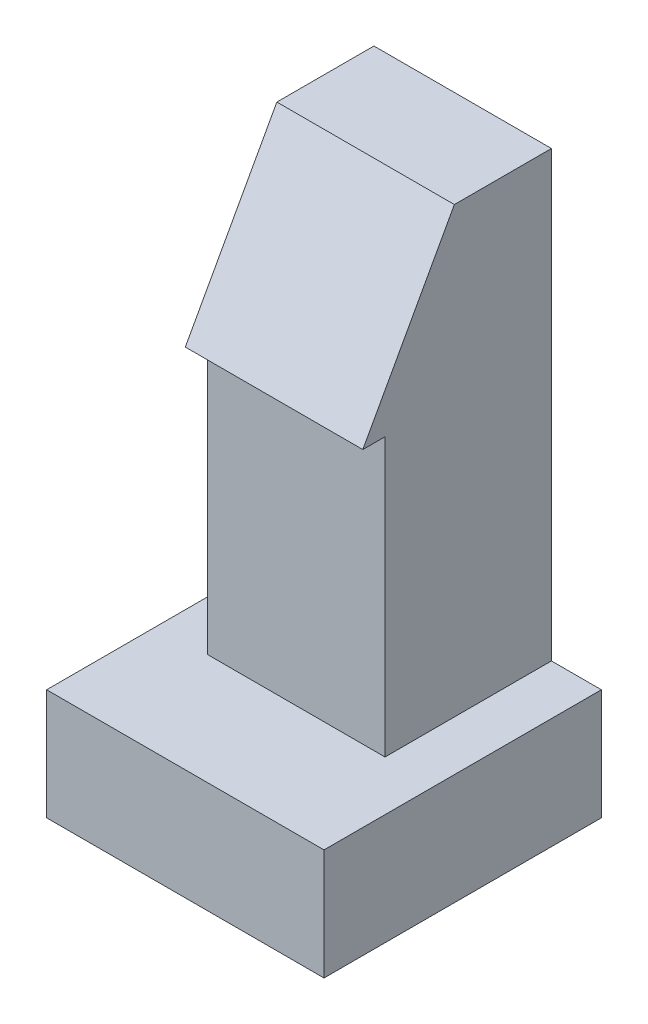
ISO-10303-21;
HEADER;
FILE_DESCRIPTION(('STEP AP214'),'2;1');
FILE_NAME('part.step','',(''),(''),'','','');
FILE_SCHEMA(('AUTOMOTIVE_DESIGN { 1 0 10303 214 1 1 1 1 }'));
ENDSEC;
DATA;
#1=APPLICATION_CONTEXT('core data for automotive mechanical design processes');
#2=APPLICATION_PROTOCOL_DEFINITION('international standard','automotive_design',2000,#1);
#3=PRODUCT_CONTEXT('',#1,'mechanical');
#4=PRODUCT('Part','Part','',(#3));
#5=PRODUCT_RELATED_PRODUCT_CATEGORY('part','',(#4));
#6=PRODUCT_DEFINITION_FORMATION('','',#4);
#7=PRODUCT_DEFINITION_CONTEXT('part definition',#1,'design');
#8=PRODUCT_DEFINITION('design','',#6,#7);
#9=PRODUCT_DEFINITION_SHAPE('','',#8);
#10=(LENGTH_UNIT() NAMED_UNIT(*) SI_UNIT(.MILLI.,.METRE.));
#11=(NAMED_UNIT(*) PLANE_ANGLE_UNIT() SI_UNIT($,.RADIAN.));
#12=(NAMED_UNIT(*) SI_UNIT($,.STERADIAN.) SOLID_ANGLE_UNIT());
#13=UNCERTAINTY_MEASURE_WITH_UNIT(LENGTH_MEASURE(1.E-05),#10,'distance_accuracy_value','');
#14=(GEOMETRIC_REPRESENTATION_CONTEXT(3) GLOBAL_UNCERTAINTY_ASSIGNED_CONTEXT((#13)) GLOBAL_UNIT_ASSIGNED_CONTEXT((#10,
#11,#12)) REPRESENTATION_CONTEXT('',''));
#15=CARTESIAN_POINT('',(0.,0.,0.));
#16=DIRECTION('',(0.,0.,1.));
#17=DIRECTION('',(1.,0.,0.));
#18=AXIS2_PLACEMENT_3D('',#15,#16,#17);
#19=CARTESIAN_POINT('',(2.5,2.,-2.5));
#20=DIRECTION('',(-1.,0.,0.));
#21=DIRECTION('',(0.,0.,1.));
#22=AXIS2_PLACEMENT_3D('',#19,#20,#21);
#23=PLANE('',#22);
#24=DIRECTION('',(0.,0.,-1.));
#25=VECTOR('',#24,1.);
#26=CARTESIAN_POINT('',(2.5,0.,-2.5));
#27=LINE('',#26,#25);
#28=CARTESIAN_POINT('',(2.5,0.,2.5));
#29=VERTEX_POINT('',#28);
#30=CARTESIAN_POINT('',(2.5,0.,-2.5));
#31=VERTEX_POINT('',#30);
#32=EDGE_CURVE('E172',#29,#31,#27,.T.);
#33=ORIENTED_EDGE('',*,*,#32,.T.);
#34=DIRECTION('',(0.,-1.,0.));
#35=VECTOR('',#34,1.);
#36=CARTESIAN_POINT('',(2.5,2.,-2.5));
#37=LINE('',#36,#35);
#38=CARTESIAN_POINT('',(2.5,2.,-2.5));
#39=VERTEX_POINT('',#38);
#40=EDGE_CURVE('E47',#39,#31,#37,.T.);
#41=ORIENTED_EDGE('',*,*,#40,.F.);
#42=DIRECTION('',(0.,0.,-1.));
#43=VECTOR('',#42,1.);
#44=CARTESIAN_POINT('',(2.5,2.,-2.5));
#45=LINE('',#44,#43);
#46=CARTESIAN_POINT('',(2.5,2.,2.5));
#47=VERTEX_POINT('',#46);
#48=EDGE_CURVE('E173',#47,#39,#45,.T.);
#49=ORIENTED_EDGE('',*,*,#48,.F.);
#50=DIRECTION('',(0.,-1.,0.));
#51=VECTOR('',#50,1.);
#52=CARTESIAN_POINT('',(2.5,2.,2.5));
#53=LINE('',#52,#51);
#54=EDGE_CURVE('E188',#47,#29,#53,.T.);
#55=ORIENTED_EDGE('',*,*,#54,.T.);
#56=EDGE_LOOP('',(#33,#41,#49,#55));
#57=FACE_BOUND('',#56,.T.);
#58=ADVANCED_FACE('F39',(#57),#23,.F.);
#59=CARTESIAN_POINT('',(-2.5,2.,-2.5));
#60=DIRECTION('',(0.,0.,1.));
#61=DIRECTION('',(1.,0.,0.));
#62=AXIS2_PLACEMENT_3D('',#59,#60,#61);
#63=PLANE('',#62);
#64=DIRECTION('',(-1.,0.,0.));
#65=VECTOR('',#64,1.);
#66=CARTESIAN_POINT('',(-2.5,0.,-2.5));
#67=LINE('',#66,#65);
#68=CARTESIAN_POINT('',(-2.5,0.,-2.5));
#69=VERTEX_POINT('',#68);
#70=EDGE_CURVE('E192',#31,#69,#67,.T.);
#71=ORIENTED_EDGE('',*,*,#70,.T.);
#72=DIRECTION('',(0.,-1.,0.));
#73=VECTOR('',#72,1.);
#74=CARTESIAN_POINT('',(-2.5,2.,-2.5));
#75=LINE('',#74,#73);
#76=CARTESIAN_POINT('',(-2.5,2.,-2.5));
#77=VERTEX_POINT('',#76);
#78=EDGE_CURVE('E207',#77,#69,#75,.T.);
#79=ORIENTED_EDGE('',*,*,#78,.F.);
#80=DIRECTION('',(-1.,0.,0.));
#81=VECTOR('',#80,1.);
#82=CARTESIAN_POINT('',(-2.5,2.,-2.5));
#83=LINE('',#82,#81);
#84=CARTESIAN_POINT('',(-1.6,2.,-2.5));
#85=VERTEX_POINT('',#84);
#86=EDGE_CURVE('E177',#85,#77,#83,.T.);
#87=ORIENTED_EDGE('',*,*,#86,.F.);
#88=DIRECTION('',(0.,-1.,0.));
#89=VECTOR('',#88,1.);
#90=CARTESIAN_POINT('',(-1.6,7.,-2.5));
#91=LINE('',#90,#89);
#92=CARTESIAN_POINT('',(-1.6,10.,-2.5));
#93=VERTEX_POINT('',#92);
#94=EDGE_CURVE('E147',#93,#85,#91,.T.);
#95=ORIENTED_EDGE('',*,*,#94,.F.);
#96=DIRECTION('',(-1.,0.,0.));
#97=VECTOR('',#96,1.);
#98=CARTESIAN_POINT('',(-1.6,10.,-2.5));
#99=LINE('',#98,#97);
#100=CARTESIAN_POINT('',(1.6,10.,-2.5));
#101=VERTEX_POINT('',#100);
#102=EDGE_CURVE('E153',#101,#93,#99,.T.);
#103=ORIENTED_EDGE('',*,*,#102,.F.);
#104=DIRECTION('',(0.,-1.,0.));
#105=VECTOR('',#104,1.);
#106=CARTESIAN_POINT('',(1.6,7.,-2.5));
#107=LINE('',#106,#105);
#108=CARTESIAN_POINT('',(1.6,2.,-2.5));
#109=VERTEX_POINT('',#108);
#110=EDGE_CURVE('E162',#101,#109,#107,.T.);
#111=ORIENTED_EDGE('',*,*,#110,.T.);
#112=EDGE_CURVE('E179',#39,#109,#83,.T.);
#113=ORIENTED_EDGE('',*,*,#112,.F.);
#114=ORIENTED_EDGE('',*,*,#40,.T.);
#115=EDGE_LOOP('',(#71,#79,#87,#95,#103,#111,#113,#114));
#116=FACE_BOUND('',#115,.T.);
#117=ADVANCED_FACE('F214',(#116),#63,.F.);
#118=CARTESIAN_POINT('',(-2.5,2.,-2.5));
#119=DIRECTION('',(1.,0.,0.));
#120=DIRECTION('',(0.,0.,-1.));
#121=AXIS2_PLACEMENT_3D('',#118,#119,#120);
#122=PLANE('',#121);
#123=DIRECTION('',(0.,0.,1.));
#124=VECTOR('',#123,1.);
#125=CARTESIAN_POINT('',(-2.5,0.,-2.5));
#126=LINE('',#125,#124);
#127=CARTESIAN_POINT('',(-2.5,0.,2.5));
#128=VERTEX_POINT('',#127);
#129=EDGE_CURVE('E195',#69,#128,#126,.T.);
#130=ORIENTED_EDGE('',*,*,#129,.T.);
#131=DIRECTION('',(0.,-1.,0.));
#132=VECTOR('',#131,1.);
#133=CARTESIAN_POINT('',(-2.5,2.,2.5));
#134=LINE('',#133,#132);
#135=CARTESIAN_POINT('',(-2.5,2.,2.5));
#136=VERTEX_POINT('',#135);
#137=EDGE_CURVE('E203',#136,#128,#134,.T.);
#138=ORIENTED_EDGE('',*,*,#137,.F.);
#139=DIRECTION('',(0.,0.,1.));
#140=VECTOR('',#139,1.);
#141=CARTESIAN_POINT('',(-2.5,2.,-2.5));
#142=LINE('',#141,#140);
#143=EDGE_CURVE('E182',#77,#136,#142,.T.);
#144=ORIENTED_EDGE('',*,*,#143,.F.);
#145=ORIENTED_EDGE('',*,*,#78,.T.);
#146=EDGE_LOOP('',(#130,#138,#144,#145));
#147=FACE_BOUND('',#146,.T.);
#148=ADVANCED_FACE('F226',(#147),#122,.F.);
#149=CARTESIAN_POINT('',(-2.5,2.,2.5));
#150=DIRECTION('',(0.,0.,-1.));
#151=DIRECTION('',(-1.,0.,0.));
#152=AXIS2_PLACEMENT_3D('',#149,#150,#151);
#153=PLANE('',#152);
#154=DIRECTION('',(1.,0.,0.));
#155=VECTOR('',#154,1.);
#156=CARTESIAN_POINT('',(-2.5,0.,2.5));
#157=LINE('',#156,#155);
#158=EDGE_CURVE('E178',#128,#29,#157,.T.);
#159=ORIENTED_EDGE('',*,*,#158,.T.);
#160=ORIENTED_EDGE('',*,*,#54,.F.);
#161=DIRECTION('',(1.,0.,0.));
#162=VECTOR('',#161,1.);
#163=CARTESIAN_POINT('',(-2.5,2.,2.5));
#164=LINE('',#163,#162);
#165=EDGE_CURVE('E185',#136,#47,#164,.T.);
#166=ORIENTED_EDGE('',*,*,#165,.F.);
#167=ORIENTED_EDGE('',*,*,#137,.T.);
#168=EDGE_LOOP('',(#159,#160,#166,#167));
#169=FACE_BOUND('',#168,.T.);
#170=ADVANCED_FACE('F230',(#169),#153,.F.);
#171=CARTESIAN_POINT('',(0.,2.,0.));
#172=DIRECTION('',(0.,1.,0.));
#173=DIRECTION('',(0.,0.,1.));
#174=AXIS2_PLACEMENT_3D('',#171,#172,#173);
#175=PLANE('',#174);
#176=DIRECTION('',(0.,0.,1.));
#177=VECTOR('',#176,1.);
#178=CARTESIAN_POINT('',(-1.6,2.,-2.5));
#179=LINE('',#178,#177);
#180=CARTESIAN_POINT('',(-1.6,2.,0.5));
#181=VERTEX_POINT('',#180);
#182=EDGE_CURVE('E149',#85,#181,#179,.T.);
#183=ORIENTED_EDGE('',*,*,#182,.F.);
#184=ORIENTED_EDGE('',*,*,#86,.T.);
#185=ORIENTED_EDGE('',*,*,#143,.T.);
#186=ORIENTED_EDGE('',*,*,#165,.T.);
#187=ORIENTED_EDGE('',*,*,#48,.T.);
#188=ORIENTED_EDGE('',*,*,#112,.T.);
#189=DIRECTION('',(0.,0.,-1.));
#190=VECTOR('',#189,1.);
#191=CARTESIAN_POINT('',(1.6,2.,-2.5));
#192=LINE('',#191,#190);
#193=CARTESIAN_POINT('',(1.6,2.,0.5));
#194=VERTEX_POINT('',#193);
#195=EDGE_CURVE('E148',#194,#109,#192,.T.);
#196=ORIENTED_EDGE('',*,*,#195,.F.);
#197=DIRECTION('',(1.,0.,0.));
#198=VECTOR('',#197,1.);
#199=CARTESIAN_POINT('',(-1.6,2.,0.5));
#200=LINE('',#199,#198);
#201=EDGE_CURVE('E61',#181,#194,#200,.T.);
#202=ORIENTED_EDGE('',*,*,#201,.F.);
#203=EDGE_LOOP('',(#183,#184,#185,#186,#187,#188,#196,#202));
#204=FACE_BOUND('',#203,.T.);
#205=ADVANCED_FACE('F231',(#204),#175,.T.);
#206=CARTESIAN_POINT('',(0.,0.,0.));
#207=DIRECTION('',(0.,1.,0.));
#208=DIRECTION('',(0.,0.,1.));
#209=AXIS2_PLACEMENT_3D('',#206,#207,#208);
#210=PLANE('',#209);
#211=ORIENTED_EDGE('',*,*,#32,.F.);
#212=ORIENTED_EDGE('',*,*,#158,.F.);
#213=ORIENTED_EDGE('',*,*,#129,.F.);
#214=ORIENTED_EDGE('',*,*,#70,.F.);
#215=EDGE_LOOP('',(#211,#212,#213,#214));
#216=FACE_BOUND('',#215,.T.);
#217=ADVANCED_FACE('F222',(#216),#210,.F.);
#218=CARTESIAN_POINT('',(-1.6,7.,-2.5));
#219=DIRECTION('',(1.,0.,0.));
#220=DIRECTION('',(0.,0.,-1.));
#221=AXIS2_PLACEMENT_3D('',#218,#219,#220);
#222=PLANE('',#221);
#223=DIRECTION('',(0.,0.,1.));
#224=VECTOR('',#223,1.);
#225=CARTESIAN_POINT('',(-1.6,7.,-2.5));
#226=LINE('',#225,#224);
#227=CARTESIAN_POINT('',(-1.6,7.,0.5));
#228=VERTEX_POINT('',#227);
#229=CARTESIAN_POINT('',(-1.6,7.,0.9));
#230=VERTEX_POINT('',#229);
#231=EDGE_CURVE('E123',#228,#230,#226,.T.);
#232=ORIENTED_EDGE('',*,*,#231,.T.);
#233=DIRECTION('',(0.,0.876215908676647,-0.481918749772156));
#234=VECTOR('',#233,1.);
#235=CARTESIAN_POINT('',(-1.6,8.43570057581574,0.110364683301344));
#236=LINE('',#235,#234);
#237=CARTESIAN_POINT('',(-1.6,10.,-0.75));
#238=VERTEX_POINT('',#237);
#239=EDGE_CURVE('E116',#230,#238,#236,.T.);
#240=ORIENTED_EDGE('',*,*,#239,.T.);
#241=DIRECTION('',(0.,0.,1.));
#242=VECTOR('',#241,1.);
#243=CARTESIAN_POINT('',(-1.6,10.,-2.5));
#244=LINE('',#243,#242);
#245=EDGE_CURVE('E138',#93,#238,#244,.T.);
#246=ORIENTED_EDGE('',*,*,#245,.F.);
#247=ORIENTED_EDGE('',*,*,#94,.T.);
#248=ORIENTED_EDGE('',*,*,#182,.T.);
#249=DIRECTION('',(0.,-1.,0.));
#250=VECTOR('',#249,1.);
#251=CARTESIAN_POINT('',(-1.6,7.,0.5));
#252=LINE('',#251,#250);
#253=EDGE_CURVE('E169',#228,#181,#252,.T.);
#254=ORIENTED_EDGE('',*,*,#253,.F.);
#255=EDGE_LOOP('',(#232,#240,#246,#247,#248,#254));
#256=FACE_BOUND('',#255,.T.);
#257=ADVANCED_FACE('F246',(#256),#222,.F.);
#258=CARTESIAN_POINT('',(-1.6,7.,0.5));
#259=DIRECTION('',(0.,0.,-1.));
#260=DIRECTION('',(-1.,0.,0.));
#261=AXIS2_PLACEMENT_3D('',#258,#259,#260);
#262=PLANE('',#261);
#263=ORIENTED_EDGE('',*,*,#201,.T.);
#264=DIRECTION('',(0.,-1.,0.));
#265=VECTOR('',#264,1.);
#266=CARTESIAN_POINT('',(1.6,7.,0.5));
#267=LINE('',#266,#265);
#268=CARTESIAN_POINT('',(1.6,7.,0.5));
#269=VERTEX_POINT('',#268);
#270=EDGE_CURVE('E166',#269,#194,#267,.T.);
#271=ORIENTED_EDGE('',*,*,#270,.F.);
#272=DIRECTION('',(1.,0.,0.));
#273=VECTOR('',#272,1.);
#274=CARTESIAN_POINT('',(-1.6,7.,0.5));
#275=LINE('',#274,#273);
#276=EDGE_CURVE('E136',#228,#269,#275,.T.);
#277=ORIENTED_EDGE('',*,*,#276,.F.);
#278=ORIENTED_EDGE('',*,*,#253,.T.);
#279=EDGE_LOOP('',(#263,#271,#277,#278));
#280=FACE_BOUND('',#279,.T.);
#281=ADVANCED_FACE('F250',(#280),#262,.F.);
#282=CARTESIAN_POINT('',(1.6,7.,-2.5));
#283=DIRECTION('',(-1.,0.,0.));
#284=DIRECTION('',(0.,0.,1.));
#285=AXIS2_PLACEMENT_3D('',#282,#283,#284);
#286=PLANE('',#285);
#287=DIRECTION('',(0.,0.,-1.));
#288=VECTOR('',#287,1.);
#289=CARTESIAN_POINT('',(1.6,10.,-2.5));
#290=LINE('',#289,#288);
#291=CARTESIAN_POINT('',(1.6,10.,-0.75));
#292=VERTEX_POINT('',#291);
#293=EDGE_CURVE('E131',#292,#101,#290,.T.);
#294=ORIENTED_EDGE('',*,*,#293,.F.);
#295=DIRECTION('',(0.,0.876215908676647,-0.481918749772156));
#296=VECTOR('',#295,1.);
#297=CARTESIAN_POINT('',(1.6,7.,0.899999999999999));
#298=LINE('',#297,#296);
#299=CARTESIAN_POINT('',(1.6,7.,0.899999999999999));
#300=VERTEX_POINT('',#299);
#301=EDGE_CURVE('E53',#300,#292,#298,.T.);
#302=ORIENTED_EDGE('',*,*,#301,.F.);
#303=DIRECTION('',(0.,0.,-1.));
#304=VECTOR('',#303,1.);
#305=CARTESIAN_POINT('',(1.6,7.,-2.5));
#306=LINE('',#305,#304);
#307=EDGE_CURVE('E122',#300,#269,#306,.T.);
#308=ORIENTED_EDGE('',*,*,#307,.T.);
#309=ORIENTED_EDGE('',*,*,#270,.T.);
#310=ORIENTED_EDGE('',*,*,#195,.T.);
#311=ORIENTED_EDGE('',*,*,#110,.F.);
#312=EDGE_LOOP('',(#294,#302,#308,#309,#310,#311));
#313=FACE_BOUND('',#312,.T.);
#314=ADVANCED_FACE('F128',(#313),#286,.F.);
#315=CARTESIAN_POINT('',(0.,7.,0.));
#316=DIRECTION('',(0.,1.,0.));
#317=DIRECTION('',(0.,0.,1.));
#318=AXIS2_PLACEMENT_3D('',#315,#316,#317);
#319=PLANE('',#318);
#320=ORIENTED_EDGE('',*,*,#231,.F.);
#321=ORIENTED_EDGE('',*,*,#276,.T.);
#322=ORIENTED_EDGE('',*,*,#307,.F.);
#323=DIRECTION('',(1.,0.,0.));
#324=VECTOR('',#323,1.);
#325=CARTESIAN_POINT('',(-1.6,7.,0.899999999999999));
#326=LINE('',#325,#324);
#327=EDGE_CURVE('E113',#230,#300,#326,.T.);
#328=ORIENTED_EDGE('',*,*,#327,.F.);
#329=EDGE_LOOP('',(#320,#321,#322,#328));
#330=FACE_BOUND('',#329,.T.);
#331=ADVANCED_FACE('F135',(#330),#319,.F.);
#332=CARTESIAN_POINT('',(0.,10.,0.));
#333=DIRECTION('',(0.,1.,0.));
#334=DIRECTION('',(0.,0.,1.));
#335=AXIS2_PLACEMENT_3D('',#332,#333,#334);
#336=PLANE('',#335);
#337=DIRECTION('',(-1.,0.,0.));
#338=VECTOR('',#337,1.);
#339=CARTESIAN_POINT('',(0.,10.,-0.75));
#340=LINE('',#339,#338);
#341=EDGE_CURVE('E11',#292,#238,#340,.T.);
#342=ORIENTED_EDGE('',*,*,#341,.F.);
#343=ORIENTED_EDGE('',*,*,#293,.T.);
#344=ORIENTED_EDGE('',*,*,#102,.T.);
#345=ORIENTED_EDGE('',*,*,#245,.T.);
#346=EDGE_LOOP('',(#342,#343,#344,#345));
#347=FACE_BOUND('',#346,.T.);
#348=ADVANCED_FACE('F247',(#347),#336,.T.);
#349=CARTESIAN_POINT('',(-2.5,7.,0.9));
#350=DIRECTION('',(0.,-0.481918749772156,-0.876215908676647));
#351=DIRECTION('',(0.,0.876215908676647,-0.481918749772156));
#352=AXIS2_PLACEMENT_3D('',#349,#350,#351);
#353=PLANE('',#352);
#354=ORIENTED_EDGE('',*,*,#327,.T.);
#355=ORIENTED_EDGE('',*,*,#301,.T.);
#356=ORIENTED_EDGE('',*,*,#341,.T.);
#357=ORIENTED_EDGE('',*,*,#239,.F.);
#358=EDGE_LOOP('',(#354,#355,#356,#357));
#359=FACE_BOUND('',#358,.T.);
#360=ADVANCED_FACE('F114',(#359),#353,.F.);
#361=CLOSED_SHELL('',(#58,#117,#148,#170,#205,#217,#257,#281,#314,#331,#348,#360));
#362=MANIFOLD_SOLID_BREP('B2',#361);
#363=ADVANCED_BREP_SHAPE_REPRESENTATION('',(#18,#362),#14);
#364=SHAPE_DEFINITION_REPRESENTATION(#9,#363);
ENDSEC;
END-ISO-10303-21;
